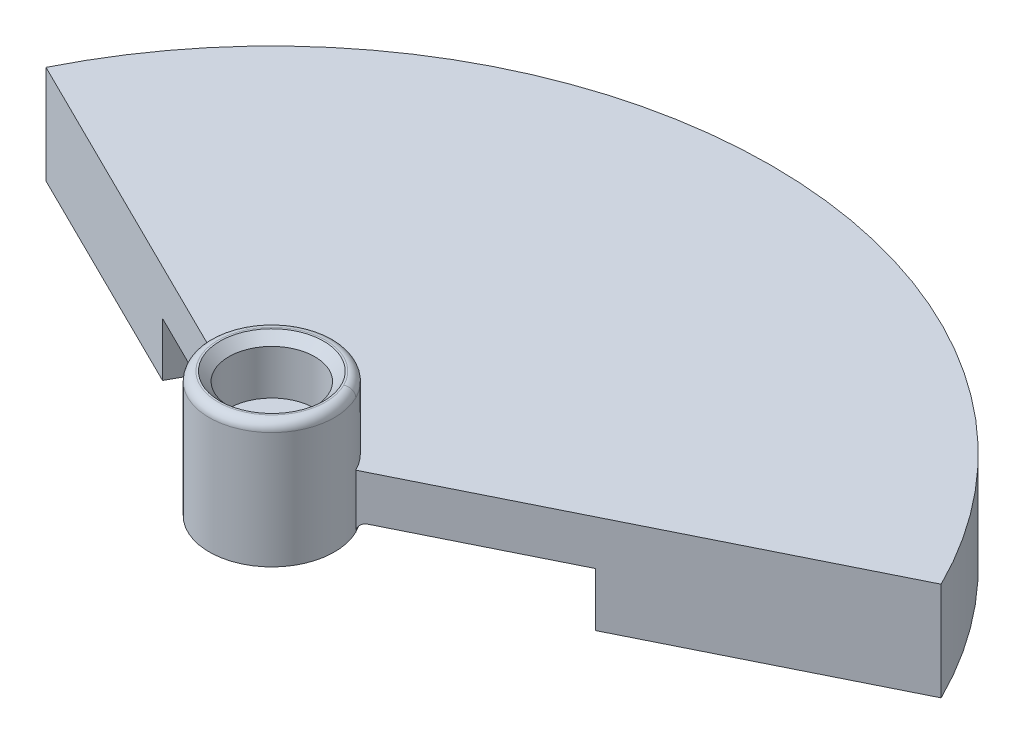
ISO-10303-21;
HEADER;
FILE_DESCRIPTION(('STEP AP214'),'2;1');
FILE_NAME('part.step','',(''),(''),'','','');
FILE_SCHEMA(('AUTOMOTIVE_DESIGN { 1 0 10303 214 1 1 1 1 }'));
ENDSEC;
DATA;
#1=APPLICATION_CONTEXT('core data for automotive mechanical design processes');
#2=APPLICATION_PROTOCOL_DEFINITION('international standard','automotive_design',2000,#1);
#3=PRODUCT_CONTEXT('',#1,'mechanical');
#4=PRODUCT('Part','Part','',(#3));
#5=PRODUCT_RELATED_PRODUCT_CATEGORY('part','',(#4));
#6=PRODUCT_DEFINITION_FORMATION('','',#4);
#7=PRODUCT_DEFINITION_CONTEXT('part definition',#1,'design');
#8=PRODUCT_DEFINITION('design','',#6,#7);
#9=PRODUCT_DEFINITION_SHAPE('','',#8);
#10=(LENGTH_UNIT() NAMED_UNIT(*) SI_UNIT(.MILLI.,.METRE.));
#11=(NAMED_UNIT(*) PLANE_ANGLE_UNIT() SI_UNIT($,.RADIAN.));
#12=(NAMED_UNIT(*) SI_UNIT($,.STERADIAN.) SOLID_ANGLE_UNIT());
#13=UNCERTAINTY_MEASURE_WITH_UNIT(LENGTH_MEASURE(1.E-05),#10,'distance_accuracy_value','');
#14=(GEOMETRIC_REPRESENTATION_CONTEXT(3) GLOBAL_UNCERTAINTY_ASSIGNED_CONTEXT((#13)) GLOBAL_UNIT_ASSIGNED_CONTEXT((#10,
#11,#12)) REPRESENTATION_CONTEXT('',''));
#15=CARTESIAN_POINT('',(0.,0.,0.));
#16=DIRECTION('',(0.,0.,1.));
#17=DIRECTION('',(1.,0.,0.));
#18=AXIS2_PLACEMENT_3D('',#15,#16,#17);
#19=CARTESIAN_POINT('',(-25.,63.5165736016329,-12.3858790564094));
#20=DIRECTION('',(0.443938317434027,0.,-0.896057347670251));
#21=DIRECTION('',(-0.896057347670251,0.,-0.443938317434027));
#22=AXIS2_PLACEMENT_3D('',#19,#20,#21);
#23=PLANE('',#22);
#24=DIRECTION('',(0.896057347670251,0.,0.443938317434027));
#25=VECTOR('',#24,1.);
#26=CARTESIAN_POINT('',(-25.,3.,-12.3858790564094));
#27=LINE('',#26,#25);
#28=CARTESIAN_POINT('',(-25.,3.,-12.3858790564094));
#29=VERTEX_POINT('',#28);
#30=CARTESIAN_POINT('',(-3.13620071684587,3.,-1.55378411101909));
#31=VERTEX_POINT('',#30);
#32=EDGE_CURVE('E112',#29,#31,#27,.T.);
#33=ORIENTED_EDGE('',*,*,#32,.F.);
#34=DIRECTION('',(0.,-1.,0.));
#35=VECTOR('',#34,1.);
#36=CARTESIAN_POINT('',(-25.,63.5165736016329,-12.3858790564094));
#37=LINE('',#36,#35);
#38=CARTESIAN_POINT('',(-25.,-2.5,-12.3858790564094));
#39=VERTEX_POINT('',#38);
#40=EDGE_CURVE('E125',#29,#39,#37,.T.);
#41=ORIENTED_EDGE('',*,*,#40,.T.);
#42=DIRECTION('',(-0.896057347670251,0.,-0.443938317434027));
#43=VECTOR('',#42,1.);
#44=CARTESIAN_POINT('',(-12.0967741935484,-2.5,-5.99316728535937));
#45=LINE('',#44,#43);
#46=CARTESIAN_POINT('',(-12.0967741935484,-2.5,-5.99316728535937));
#47=VERTEX_POINT('',#46);
#48=EDGE_CURVE('E303',#47,#39,#45,.T.);
#49=ORIENTED_EDGE('',*,*,#48,.F.);
#50=DIRECTION('',(0.,1.,0.));
#51=VECTOR('',#50,1.);
#52=CARTESIAN_POINT('',(-12.0967741935484,-2.5,-5.99316728535937));
#53=LINE('',#52,#51);
#54=CARTESIAN_POINT('',(-12.0967741935484,0.5,-5.99316728535937));
#55=VERTEX_POINT('',#54);
#56=EDGE_CURVE('E291',#47,#55,#53,.T.);
#57=ORIENTED_EDGE('',*,*,#56,.T.);
#58=DIRECTION('',(-0.896057347670251,0.,-0.443938317434027));
#59=VECTOR('',#58,1.);
#60=CARTESIAN_POINT('',(-25.,0.5,-12.3858790564094));
#61=LINE('',#60,#59);
#62=CARTESIAN_POINT('',(-3.584229390681,0.5,-1.77575326973611));
#63=VERTEX_POINT('',#62);
#64=EDGE_CURVE('E131',#63,#55,#61,.T.);
#65=ORIENTED_EDGE('',*,*,#64,.F.);
#66=CARTESIAN_POINT('',(-3.584229390681,0.,-1.77575326973611));
#67=DIRECTION('',(0.443938317434027,0.,-0.896057347670251));
#68=DIRECTION('',(-0.896057347670251,0.,-0.443938317434027));
#69=AXIS2_PLACEMENT_3D('',#66,#67,#68);
#70=CIRCLE('',#69,0.5);
#71=CARTESIAN_POINT('',(-3.13620071684588,0.,-1.5537841110191));
#72=VERTEX_POINT('',#71);
#73=EDGE_CURVE('E185',#63,#72,#70,.T.);
#74=ORIENTED_EDGE('',*,*,#73,.T.);
#75=DIRECTION('',(0.,-1.,0.));
#76=VECTOR('',#75,1.);
#77=CARTESIAN_POINT('',(-3.13620071684587,63.5165736016329,-1.5537841110191));
#78=LINE('',#77,#76);
#79=EDGE_CURVE('E123',#31,#72,#78,.T.);
#80=ORIENTED_EDGE('',*,*,#79,.F.);
#81=EDGE_LOOP('',(#33,#41,#49,#57,#65,#74,#80));
#82=FACE_BOUND('',#81,.T.);
#83=ADVANCED_FACE('F43',(#82),#23,.F.);
#84=CARTESIAN_POINT('',(25.,63.5165736016329,-12.3858790564094));
#85=DIRECTION('',(-0.443938317434027,0.,-0.896057347670251));
#86=DIRECTION('',(-0.896057347670251,0.,0.443938317434027));
#87=AXIS2_PLACEMENT_3D('',#84,#85,#86);
#88=PLANE('',#87);
#89=DIRECTION('',(0.896057347670251,0.,-0.443938317434027));
#90=VECTOR('',#89,1.);
#91=CARTESIAN_POINT('',(3.13620071684587,3.,-1.5537841110191));
#92=LINE('',#91,#90);
#93=CARTESIAN_POINT('',(3.13620071684588,3.,-1.5537841110191));
#94=VERTEX_POINT('',#93);
#95=CARTESIAN_POINT('',(25.,3.,-12.3858790564094));
#96=VERTEX_POINT('',#95);
#97=EDGE_CURVE('E116',#94,#96,#92,.T.);
#98=ORIENTED_EDGE('',*,*,#97,.F.);
#99=DIRECTION('',(0.,-1.,0.));
#100=VECTOR('',#99,1.);
#101=CARTESIAN_POINT('',(3.13620071684588,63.5165736016329,-1.5537841110191));
#102=LINE('',#101,#100);
#103=CARTESIAN_POINT('',(3.13620071684588,0.,-1.5537841110191));
#104=VERTEX_POINT('',#103);
#105=EDGE_CURVE('E132',#94,#104,#102,.T.);
#106=ORIENTED_EDGE('',*,*,#105,.T.);
#107=CARTESIAN_POINT('',(3.584229390681,0.,-1.77575326973611));
#108=DIRECTION('',(-0.443938317434027,0.,-0.896057347670251));
#109=DIRECTION('',(-0.896057347670251,0.,0.443938317434027));
#110=AXIS2_PLACEMENT_3D('',#107,#108,#109);
#111=CIRCLE('',#110,0.5);
#112=CARTESIAN_POINT('',(3.584229390681,0.5,-1.77575326973611));
#113=VERTEX_POINT('',#112);
#114=EDGE_CURVE('E183',#104,#113,#111,.T.);
#115=ORIENTED_EDGE('',*,*,#114,.T.);
#116=DIRECTION('',(-0.896057347670251,0.,0.443938317434027));
#117=VECTOR('',#116,1.);
#118=CARTESIAN_POINT('',(25.,0.5,-12.3858790564094));
#119=LINE('',#118,#117);
#120=CARTESIAN_POINT('',(12.0967741935484,0.5,-5.99316728535937));
#121=VERTEX_POINT('',#120);
#122=EDGE_CURVE('E281',#121,#113,#119,.T.);
#123=ORIENTED_EDGE('',*,*,#122,.F.);
#124=DIRECTION('',(0.,1.,0.));
#125=VECTOR('',#124,1.);
#126=CARTESIAN_POINT('',(12.0967741935484,-2.5,-5.99316728535937));
#127=LINE('',#126,#125);
#128=CARTESIAN_POINT('',(12.0967741935484,-2.5,-5.99316728535937));
#129=VERTEX_POINT('',#128);
#130=EDGE_CURVE('E295',#129,#121,#127,.T.);
#131=ORIENTED_EDGE('',*,*,#130,.F.);
#132=DIRECTION('',(-0.896057347670251,0.,0.443938317434027));
#133=VECTOR('',#132,1.);
#134=CARTESIAN_POINT('',(25.,-2.5,-12.3858790564094));
#135=LINE('',#134,#133);
#136=CARTESIAN_POINT('',(25.,-2.5,-12.3858790564094));
#137=VERTEX_POINT('',#136);
#138=EDGE_CURVE('E296',#137,#129,#135,.T.);
#139=ORIENTED_EDGE('',*,*,#138,.F.);
#140=DIRECTION('',(0.,-1.,0.));
#141=VECTOR('',#140,1.);
#142=CARTESIAN_POINT('',(25.,63.5165736016329,-12.3858790564094));
#143=LINE('',#142,#141);
#144=EDGE_CURVE('E133',#96,#137,#143,.T.);
#145=ORIENTED_EDGE('',*,*,#144,.F.);
#146=EDGE_LOOP('',(#98,#106,#115,#123,#131,#139,#145));
#147=FACE_BOUND('',#146,.T.);
#148=ADVANCED_FACE('F196',(#147),#88,.F.);
#149=CARTESIAN_POINT('',(0.,7.,0.));
#150=DIRECTION('',(0.,1.,0.));
#151=DIRECTION('',(0.,0.,1.));
#152=AXIS2_PLACEMENT_3D('',#149,#150,#151);
#153=PLANE('',#152);
#154=CARTESIAN_POINT('',(0.,7.,0.));
#155=DIRECTION('',(0.,1.,0.));
#156=DIRECTION('',(0.,0.,1.));
#157=AXIS2_PLACEMENT_3D('',#154,#155,#156);
#158=CIRCLE('',#157,2.9);
#159=CARTESIAN_POINT('',(0.,7.,2.9));
#160=VERTEX_POINT('',#159);
#161=EDGE_CURVE('E158',#160,#160,#158,.F.);
#162=ORIENTED_EDGE('',*,*,#161,.T.);
#163=EDGE_LOOP('',(#162));
#164=FACE_BOUND('',#163,.T.);
#165=CARTESIAN_POINT('',(0.,7.,0.));
#166=DIRECTION('',(0.,1.,0.));
#167=DIRECTION('',(0.,0.,1.));
#168=AXIS2_PLACEMENT_3D('',#165,#166,#167);
#169=CIRCLE('',#168,3.);
#170=CARTESIAN_POINT('',(-2.68817204301075,7.,-1.33181495230208));
#171=VERTEX_POINT('',#170);
#172=CARTESIAN_POINT('',(2.68817204301075,7.,-1.33181495230208));
#173=VERTEX_POINT('',#172);
#174=EDGE_CURVE('E169',#171,#173,#169,.T.);
#175=ORIENTED_EDGE('',*,*,#174,.T.);
#176=CARTESIAN_POINT('',(0.,7.,0.));
#177=DIRECTION('',(0.,1.,0.));
#178=DIRECTION('',(0.,0.,1.));
#179=AXIS2_PLACEMENT_3D('',#176,#177,#178);
#180=CIRCLE('',#179,3.);
#181=EDGE_CURVE('E12',#173,#171,#180,.T.);
#182=ORIENTED_EDGE('',*,*,#181,.T.);
#183=EDGE_LOOP('',(#175,#182));
#184=FACE_BOUND('',#183,.T.);
#185=ADVANCED_FACE('F197',(#164,#184),#153,.T.);
#186=CARTESIAN_POINT('',(0.,63.5165736016329,0.));
#187=DIRECTION('',(0.,-1.,0.));
#188=DIRECTION('',(0.,0.,-1.));
#189=AXIS2_PLACEMENT_3D('',#186,#187,#188);
#190=CYLINDRICAL_SURFACE('',#189,27.9);
#191=CARTESIAN_POINT('',(0.,3.,0.));
#192=DIRECTION('',(0.,1.,0.));
#193=DIRECTION('',(0.,0.,1.));
#194=AXIS2_PLACEMENT_3D('',#191,#192,#193);
#195=CIRCLE('',#194,27.9);
#196=EDGE_CURVE('E111',#96,#29,#195,.T.);
#197=ORIENTED_EDGE('',*,*,#196,.F.);
#198=ORIENTED_EDGE('',*,*,#144,.T.);
#199=CARTESIAN_POINT('',(0.,-2.5,0.));
#200=DIRECTION('',(0.,-1.,0.));
#201=DIRECTION('',(0.,0.,-1.));
#202=AXIS2_PLACEMENT_3D('',#199,#200,#201);
#203=CIRCLE('',#202,27.9);
#204=EDGE_CURVE('E127',#39,#137,#203,.T.);
#205=ORIENTED_EDGE('',*,*,#204,.F.);
#206=ORIENTED_EDGE('',*,*,#40,.F.);
#207=EDGE_LOOP('',(#197,#198,#205,#206));
#208=FACE_BOUND('',#207,.T.);
#209=ADVANCED_FACE('F130',(#208),#190,.T.);
#210=CARTESIAN_POINT('',(0.,3.,0.));
#211=DIRECTION('',(0.,-1.,0.));
#212=DIRECTION('',(0.,0.,-1.));
#213=AXIS2_PLACEMENT_3D('',#210,#211,#212);
#214=CYLINDRICAL_SURFACE('',#213,3.5);
#215=CARTESIAN_POINT('',(0.,3.,0.));
#216=DIRECTION('',(0.,-1.,0.));
#217=DIRECTION('',(0.,0.,-1.));
#218=AXIS2_PLACEMENT_3D('',#215,#216,#217);
#219=CIRCLE('',#218,3.5);
#220=EDGE_CURVE('E59',#31,#94,#219,.T.);
#221=ORIENTED_EDGE('',*,*,#220,.F.);
#222=ORIENTED_EDGE('',*,*,#79,.T.);
#223=CARTESIAN_POINT('',(0.,0.,0.));
#224=DIRECTION('',(0.,1.,0.));
#225=DIRECTION('',(0.,0.,1.));
#226=AXIS2_PLACEMENT_3D('',#223,#224,#225);
#227=CIRCLE('',#226,3.5);
#228=EDGE_CURVE('E152',#72,#104,#227,.T.);
#229=ORIENTED_EDGE('',*,*,#228,.T.);
#230=ORIENTED_EDGE('',*,*,#105,.F.);
#231=EDGE_LOOP('',(#221,#222,#229,#230));
#232=FACE_BOUND('',#231,.T.);
#233=CARTESIAN_POINT('',(0.,6.5,0.));
#234=DIRECTION('',(0.,1.,0.));
#235=DIRECTION('',(0.,0.,1.));
#236=AXIS2_PLACEMENT_3D('',#233,#234,#235);
#237=CIRCLE('',#236,3.5);
#238=CARTESIAN_POINT('',(3.13620071684587,6.5,-1.5537841110191));
#239=VERTEX_POINT('',#238);
#240=CARTESIAN_POINT('',(-3.13620071684587,6.5,-1.55378411101909));
#241=VERTEX_POINT('',#240);
#242=EDGE_CURVE('E175',#239,#241,#237,.F.);
#243=ORIENTED_EDGE('',*,*,#242,.T.);
#244=CARTESIAN_POINT('',(0.,6.5,0.));
#245=DIRECTION('',(0.,1.,0.));
#246=DIRECTION('',(0.,0.,1.));
#247=AXIS2_PLACEMENT_3D('',#244,#245,#246);
#248=CIRCLE('',#247,3.5);
#249=EDGE_CURVE('E51',#241,#239,#248,.F.);
#250=ORIENTED_EDGE('',*,*,#249,.T.);
#251=EDGE_LOOP('',(#243,#250));
#252=FACE_BOUND('',#251,.T.);
#253=ADVANCED_FACE('F188',(#232,#252),#214,.T.);
#254=CARTESIAN_POINT('',(0.,4.,0.));
#255=DIRECTION('',(0.,1.,0.));
#256=DIRECTION('',(0.,0.,1.));
#257=AXIS2_PLACEMENT_3D('',#254,#255,#256);
#258=PLANE('',#257);
#259=CARTESIAN_POINT('',(0.,4.,0.));
#260=DIRECTION('',(0.,1.,0.));
#261=DIRECTION('',(0.,0.,1.));
#262=AXIS2_PLACEMENT_3D('',#259,#260,#261);
#263=CIRCLE('',#262,1.3);
#264=CARTESIAN_POINT('',(0.,4.,1.3));
#265=VERTEX_POINT('',#264);
#266=EDGE_CURVE('E144',#265,#265,#263,.T.);
#267=ORIENTED_EDGE('',*,*,#266,.F.);
#268=EDGE_LOOP('',(#267));
#269=FACE_BOUND('',#268,.T.);
#270=CARTESIAN_POINT('',(0.,4.,0.));
#271=DIRECTION('',(0.,1.,0.));
#272=DIRECTION('',(0.,0.,1.));
#273=AXIS2_PLACEMENT_3D('',#270,#271,#272);
#274=CIRCLE('',#273,2.4);
#275=CARTESIAN_POINT('',(0.,4.,2.4));
#276=VERTEX_POINT('',#275);
#277=EDGE_CURVE('E138',#276,#276,#274,.T.);
#278=ORIENTED_EDGE('',*,*,#277,.T.);
#279=EDGE_LOOP('',(#278));
#280=FACE_BOUND('',#279,.T.);
#281=ADVANCED_FACE('F237',(#269,#280),#258,.T.);
#282=CARTESIAN_POINT('',(0.,0.,0.));
#283=DIRECTION('',(0.,1.,0.));
#284=DIRECTION('',(0.,0.,1.));
#285=AXIS2_PLACEMENT_3D('',#282,#283,#284);
#286=PLANE('',#285);
#287=CARTESIAN_POINT('',(0.,0.,0.));
#288=DIRECTION('',(0.,1.,0.));
#289=DIRECTION('',(0.,0.,1.));
#290=AXIS2_PLACEMENT_3D('',#287,#288,#289);
#291=CIRCLE('',#290,3.);
#292=CARTESIAN_POINT('',(0.,0.,3.));
#293=VERTEX_POINT('',#292);
#294=EDGE_CURVE('E161',#293,#293,#291,.T.);
#295=ORIENTED_EDGE('',*,*,#294,.T.);
#296=EDGE_LOOP('',(#295));
#297=FACE_BOUND('',#296,.T.);
#298=EDGE_CURVE('E155',#104,#72,#227,.T.);
#299=ORIENTED_EDGE('',*,*,#298,.F.);
#300=ORIENTED_EDGE('',*,*,#228,.F.);
#301=EDGE_LOOP('',(#299,#300));
#302=FACE_BOUND('',#301,.T.);
#303=ADVANCED_FACE('F241',(#297,#302),#286,.F.);
#304=CARTESIAN_POINT('',(0.,3.,0.));
#305=DIRECTION('',(0.,-1.,0.));
#306=DIRECTION('',(0.,0.,-1.));
#307=AXIS2_PLACEMENT_3D('',#304,#305,#306);
#308=CYLINDRICAL_SURFACE('',#307,2.5);
#309=CARTESIAN_POINT('',(0.,0.500000000000002,0.));
#310=DIRECTION('',(0.,1.,0.));
#311=DIRECTION('',(0.,0.,1.));
#312=AXIS2_PLACEMENT_3D('',#309,#310,#311);
#313=CIRCLE('',#312,2.5);
#314=CARTESIAN_POINT('',(0.,0.500000000000002,2.5));
#315=VERTEX_POINT('',#314);
#316=EDGE_CURVE('E168',#315,#315,#313,.F.);
#317=ORIENTED_EDGE('',*,*,#316,.T.);
#318=EDGE_LOOP('',(#317));
#319=FACE_BOUND('',#318,.T.);
#320=CARTESIAN_POINT('',(0.,3.,0.));
#321=DIRECTION('',(0.,1.,0.));
#322=DIRECTION('',(0.,0.,1.));
#323=AXIS2_PLACEMENT_3D('',#320,#321,#322);
#324=CIRCLE('',#323,2.5);
#325=CARTESIAN_POINT('',(0.,3.,2.5));
#326=VERTEX_POINT('',#325);
#327=EDGE_CURVE('E147',#326,#326,#324,.T.);
#328=ORIENTED_EDGE('',*,*,#327,.T.);
#329=EDGE_LOOP('',(#328));
#330=FACE_BOUND('',#329,.T.);
#331=ADVANCED_FACE('F250',(#319,#330),#308,.F.);
#332=CARTESIAN_POINT('',(0.,3.,0.));
#333=DIRECTION('',(0.,1.,0.));
#334=DIRECTION('',(0.,0.,1.));
#335=AXIS2_PLACEMENT_3D('',#332,#333,#334);
#336=PLANE('',#335);
#337=CARTESIAN_POINT('',(0.,3.,0.));
#338=DIRECTION('',(0.,1.,0.));
#339=DIRECTION('',(0.,0.,1.));
#340=AXIS2_PLACEMENT_3D('',#337,#338,#339);
#341=CIRCLE('',#340,1.3);
#342=CARTESIAN_POINT('',(0.,3.,1.3));
#343=VERTEX_POINT('',#342);
#344=EDGE_CURVE('E146',#343,#343,#341,.F.);
#345=ORIENTED_EDGE('',*,*,#344,.F.);
#346=EDGE_LOOP('',(#345));
#347=FACE_BOUND('',#346,.T.);
#348=ORIENTED_EDGE('',*,*,#327,.F.);
#349=EDGE_LOOP('',(#348));
#350=FACE_BOUND('',#349,.T.);
#351=ADVANCED_FACE('F231',(#347,#350),#336,.F.);
#352=CARTESIAN_POINT('',(0.,-0.00100000000000013,0.));
#353=DIRECTION('',(0.,1.,0.));
#354=DIRECTION('',(0.,0.,1.));
#355=AXIS2_PLACEMENT_3D('',#352,#353,#354);
#356=CYLINDRICAL_SURFACE('',#355,1.3);
#357=ORIENTED_EDGE('',*,*,#266,.T.);
#358=EDGE_LOOP('',(#357));
#359=FACE_BOUND('',#358,.T.);
#360=ORIENTED_EDGE('',*,*,#344,.T.);
#361=EDGE_LOOP('',(#360));
#362=FACE_BOUND('',#361,.T.);
#363=ADVANCED_FACE('F224',(#359,#362),#356,.F.);
#364=CARTESIAN_POINT('',(0.,7.,0.));
#365=DIRECTION('',(0.,-1.,0.));
#366=DIRECTION('',(0.,0.,-1.));
#367=AXIS2_PLACEMENT_3D('',#364,#365,#366);
#368=CYLINDRICAL_SURFACE('',#367,2.4);
#369=CARTESIAN_POINT('',(0.,6.5,0.));
#370=DIRECTION('',(0.,1.,0.));
#371=DIRECTION('',(0.,0.,1.));
#372=AXIS2_PLACEMENT_3D('',#369,#370,#371);
#373=CIRCLE('',#372,2.4);
#374=CARTESIAN_POINT('',(0.,6.5,2.4));
#375=VERTEX_POINT('',#374);
#376=EDGE_CURVE('E160',#375,#375,#373,.T.);
#377=ORIENTED_EDGE('',*,*,#376,.T.);
#378=EDGE_LOOP('',(#377));
#379=FACE_BOUND('',#378,.T.);
#380=ORIENTED_EDGE('',*,*,#277,.F.);
#381=EDGE_LOOP('',(#380));
#382=FACE_BOUND('',#381,.T.);
#383=ADVANCED_FACE('F216',(#379,#382),#368,.F.);
#384=CARTESIAN_POINT('',(0.,6.5,0.));
#385=DIRECTION('',(0.,1.,0.));
#386=DIRECTION('',(0.,0.,1.));
#387=AXIS2_PLACEMENT_3D('',#384,#385,#386);
#388=CONICAL_SURFACE('',#387,2.4,0.78539816339745);
#389=ORIENTED_EDGE('',*,*,#161,.F.);
#390=EDGE_LOOP('',(#389));
#391=FACE_BOUND('',#390,.T.);
#392=ORIENTED_EDGE('',*,*,#376,.F.);
#393=EDGE_LOOP('',(#392));
#394=FACE_BOUND('',#393,.T.);
#395=ADVANCED_FACE('F225',(#391,#394),#388,.F.);
#396=CARTESIAN_POINT('',(0.,0.,0.));
#397=DIRECTION('',(0.,-1.,0.));
#398=DIRECTION('',(0.,0.,-1.));
#399=AXIS2_PLACEMENT_3D('',#396,#397,#398);
#400=CONICAL_SURFACE('',#399,3.,0.785398163397447);
#401=ORIENTED_EDGE('',*,*,#316,.F.);
#402=EDGE_LOOP('',(#401));
#403=FACE_BOUND('',#402,.T.);
#404=ORIENTED_EDGE('',*,*,#294,.F.);
#405=EDGE_LOOP('',(#404));
#406=FACE_BOUND('',#405,.T.);
#407=ADVANCED_FACE('F230',(#403,#406),#400,.F.);
#408=CARTESIAN_POINT('',(0.,0.5,0.));
#409=DIRECTION('',(0.,1.,0.));
#410=DIRECTION('',(0.,0.,1.));
#411=AXIS2_PLACEMENT_3D('',#408,#409,#410);
#412=PLANE('',#411);
#413=CARTESIAN_POINT('',(0.,0.5,0.));
#414=DIRECTION('',(0.,1.,0.));
#415=DIRECTION('',(0.,0.,-1.));
#416=AXIS2_PLACEMENT_3D('',#413,#414,#415);
#417=CIRCLE('',#416,13.5);
#418=EDGE_CURVE('E68',#121,#55,#417,.T.);
#419=ORIENTED_EDGE('',*,*,#418,.F.);
#420=ORIENTED_EDGE('',*,*,#122,.T.);
#421=CARTESIAN_POINT('',(0.,0.5,0.));
#422=DIRECTION('',(0.,1.,0.));
#423=DIRECTION('',(0.,0.,1.));
#424=AXIS2_PLACEMENT_3D('',#421,#422,#423);
#425=CIRCLE('',#424,4.);
#426=EDGE_CURVE('E172',#113,#63,#425,.T.);
#427=ORIENTED_EDGE('',*,*,#426,.T.);
#428=ORIENTED_EDGE('',*,*,#64,.T.);
#429=EDGE_LOOP('',(#419,#420,#427,#428));
#430=FACE_BOUND('',#429,.T.);
#431=ADVANCED_FACE('F270',(#430),#412,.F.);
#432=CARTESIAN_POINT('',(0.,6.5,0.));
#433=DIRECTION('',(0.,1.,0.));
#434=DIRECTION('',(0.,0.,1.));
#435=AXIS2_PLACEMENT_3D('',#432,#433,#434);
#436=TOROIDAL_SURFACE('',#435,3.,0.5);
#437=CARTESIAN_POINT('',(-2.68817204301075,6.5,-1.33181495230208));
#438=DIRECTION('',(0.443938317434027,0.,-0.896057347670251));
#439=DIRECTION('',(-0.896057347670251,0.,-0.443938317434027));
#440=AXIS2_PLACEMENT_3D('',#437,#438,#439);
#441=CIRCLE('',#440,0.5);
#442=EDGE_CURVE('E177',#241,#171,#441,.T.);
#443=ORIENTED_EDGE('',*,*,#442,.F.);
#444=ORIENTED_EDGE('',*,*,#242,.F.);
#445=CARTESIAN_POINT('',(2.68817204301075,6.5,-1.33181495230208));
#446=DIRECTION('',(-0.443938317434027,0.,-0.896057347670251));
#447=DIRECTION('',(-0.896057347670251,0.,0.443938317434027));
#448=AXIS2_PLACEMENT_3D('',#445,#446,#447);
#449=CIRCLE('',#448,0.5);
#450=EDGE_CURVE('E180',#173,#239,#449,.T.);
#451=ORIENTED_EDGE('',*,*,#450,.F.);
#452=ORIENTED_EDGE('',*,*,#174,.F.);
#453=EDGE_LOOP('',(#443,#444,#451,#452));
#454=FACE_BOUND('',#453,.T.);
#455=ADVANCED_FACE('F193',(#454),#436,.T.);
#456=CARTESIAN_POINT('',(0.,0.,0.));
#457=DIRECTION('',(0.,1.,0.));
#458=DIRECTION('',(0.,0.,1.));
#459=AXIS2_PLACEMENT_3D('',#456,#457,#458);
#460=TOROIDAL_SURFACE('',#459,4.,0.5);
#461=ORIENTED_EDGE('',*,*,#114,.F.);
#462=ORIENTED_EDGE('',*,*,#298,.T.);
#463=ORIENTED_EDGE('',*,*,#73,.F.);
#464=ORIENTED_EDGE('',*,*,#426,.F.);
#465=EDGE_LOOP('',(#461,#462,#463,#464));
#466=FACE_BOUND('',#465,.T.);
#467=ADVANCED_FACE('F268',(#466),#460,.F.);
#468=CARTESIAN_POINT('',(0.,-2.5,0.));
#469=DIRECTION('',(0.,1.,0.));
#470=DIRECTION('',(0.,0.,1.));
#471=AXIS2_PLACEMENT_3D('',#468,#469,#470);
#472=CYLINDRICAL_SURFACE('',#471,13.5);
#473=ORIENTED_EDGE('',*,*,#418,.T.);
#474=ORIENTED_EDGE('',*,*,#56,.F.);
#475=CARTESIAN_POINT('',(0.,-2.5,0.));
#476=DIRECTION('',(0.,1.,0.));
#477=DIRECTION('',(0.,0.,-1.));
#478=AXIS2_PLACEMENT_3D('',#475,#476,#477);
#479=CIRCLE('',#478,13.5);
#480=EDGE_CURVE('E297',#129,#47,#479,.T.);
#481=ORIENTED_EDGE('',*,*,#480,.F.);
#482=ORIENTED_EDGE('',*,*,#130,.T.);
#483=EDGE_LOOP('',(#473,#474,#481,#482));
#484=FACE_BOUND('',#483,.T.);
#485=ADVANCED_FACE('F275',(#484),#472,.F.);
#486=CARTESIAN_POINT('',(0.,-2.5,0.));
#487=DIRECTION('',(0.,-1.,0.));
#488=DIRECTION('',(0.,0.,-1.));
#489=AXIS2_PLACEMENT_3D('',#486,#487,#488);
#490=PLANE('',#489);
#491=ORIENTED_EDGE('',*,*,#480,.T.);
#492=ORIENTED_EDGE('',*,*,#48,.T.);
#493=ORIENTED_EDGE('',*,*,#204,.T.);
#494=ORIENTED_EDGE('',*,*,#138,.T.);
#495=EDGE_LOOP('',(#491,#492,#493,#494));
#496=FACE_BOUND('',#495,.T.);
#497=ADVANCED_FACE('F280',(#496),#490,.T.);
#498=CARTESIAN_POINT('',(0.,3.,0.));
#499=DIRECTION('',(0.,1.,0.));
#500=DIRECTION('',(0.,0.,1.));
#501=AXIS2_PLACEMENT_3D('',#498,#499,#500);
#502=PLANE('',#501);
#503=ORIENTED_EDGE('',*,*,#196,.T.);
#504=ORIENTED_EDGE('',*,*,#32,.T.);
#505=ORIENTED_EDGE('',*,*,#220,.T.);
#506=ORIENTED_EDGE('',*,*,#97,.T.);
#507=EDGE_LOOP('',(#503,#504,#505,#506));
#508=FACE_BOUND('',#507,.T.);
#509=ADVANCED_FACE('F113',(#508),#502,.T.);
#510=CARTESIAN_POINT('',(0.,6.5,0.));
#511=DIRECTION('',(0.,1.,0.));
#512=DIRECTION('',(0.,0.,1.));
#513=AXIS2_PLACEMENT_3D('',#510,#511,#512);
#514=TOROIDAL_SURFACE('',#513,3.,0.5);
#515=ORIENTED_EDGE('',*,*,#442,.T.);
#516=ORIENTED_EDGE('',*,*,#181,.F.);
#517=ORIENTED_EDGE('',*,*,#450,.T.);
#518=ORIENTED_EDGE('',*,*,#249,.F.);
#519=EDGE_LOOP('',(#515,#516,#517,#518));
#520=FACE_BOUND('',#519,.T.);
#521=ADVANCED_FACE('F44',(#520),#514,.T.);
#522=CLOSED_SHELL('',(#83,#148,#185,#209,#253,#281,#303,#331,#351,#363,#383,#395,#407,#431,#455,
#467,#485,#497,#509,#521));
#523=MANIFOLD_SOLID_BREP('B2',#522);
#524=ADVANCED_BREP_SHAPE_REPRESENTATION('',(#18,#523),#14);
#525=SHAPE_DEFINITION_REPRESENTATION(#9,#524);
ENDSEC;
END-ISO-10303-21;
